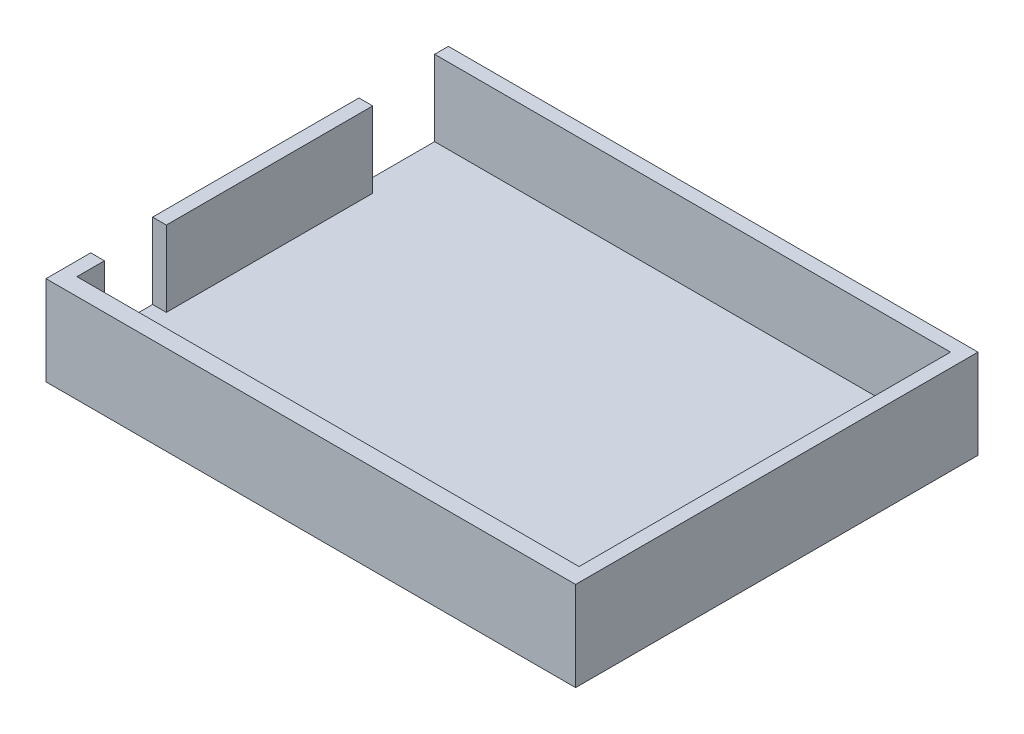
ISO-10303-21;
HEADER;
FILE_DESCRIPTION(('STEP AP214'),'2;1');
FILE_NAME('part.step','',(''),(''),'','','');
FILE_SCHEMA(('AUTOMOTIVE_DESIGN { 1 0 10303 214 1 1 1 1 }'));
ENDSEC;
DATA;
#1=APPLICATION_CONTEXT('core data for automotive mechanical design processes');
#2=APPLICATION_PROTOCOL_DEFINITION('international standard','automotive_design',2000,#1);
#3=PRODUCT_CONTEXT('',#1,'mechanical');
#4=PRODUCT('Part','Part','',(#3));
#5=PRODUCT_RELATED_PRODUCT_CATEGORY('part','',(#4));
#6=PRODUCT_DEFINITION_FORMATION('','',#4);
#7=PRODUCT_DEFINITION_CONTEXT('part definition',#1,'design');
#8=PRODUCT_DEFINITION('design','',#6,#7);
#9=PRODUCT_DEFINITION_SHAPE('','',#8);
#10=(LENGTH_UNIT() NAMED_UNIT(*) SI_UNIT(.MILLI.,.METRE.));
#11=(NAMED_UNIT(*) PLANE_ANGLE_UNIT() SI_UNIT($,.RADIAN.));
#12=(NAMED_UNIT(*) SI_UNIT($,.STERADIAN.) SOLID_ANGLE_UNIT());
#13=UNCERTAINTY_MEASURE_WITH_UNIT(LENGTH_MEASURE(1.E-05),#10,'distance_accuracy_value','');
#14=(GEOMETRIC_REPRESENTATION_CONTEXT(3) GLOBAL_UNCERTAINTY_ASSIGNED_CONTEXT((#13)) GLOBAL_UNIT_ASSIGNED_CONTEXT((#10,
#11,#12)) REPRESENTATION_CONTEXT('',''));
#15=CARTESIAN_POINT('',(0.,0.,0.));
#16=DIRECTION('',(0.,0.,1.));
#17=DIRECTION('',(1.,0.,0.));
#18=AXIS2_PLACEMENT_3D('',#15,#16,#17);
#19=CARTESIAN_POINT('',(0.,13.,0.));
#20=DIRECTION('',(0.,-1.,0.));
#21=DIRECTION('',(0.,0.,-1.));
#22=AXIS2_PLACEMENT_3D('',#19,#20,#21);
#23=PLANE('',#22);
#24=DIRECTION('',(0.,0.,1.));
#25=VECTOR('',#24,1.);
#26=CARTESIAN_POINT('',(-36.5,13.,26.75));
#27=LINE('',#26,#25);
#28=CARTESIAN_POINT('',(-36.5,13.,-16.25));
#29=VERTEX_POINT('',#28);
#30=CARTESIAN_POINT('',(-36.5,13.,13.75));
#31=VERTEX_POINT('',#30);
#32=EDGE_CURVE('E151',#29,#31,#27,.T.);
#33=ORIENTED_EDGE('',*,*,#32,.F.);
#34=DIRECTION('',(-1.,0.,0.));
#35=VECTOR('',#34,1.);
#36=CARTESIAN_POINT('',(38.501,13.,-16.25));
#37=LINE('',#36,#35);
#38=CARTESIAN_POINT('',(-38.5,13.,-16.25));
#39=VERTEX_POINT('',#38);
#40=EDGE_CURVE('E136',#29,#39,#37,.T.);
#41=ORIENTED_EDGE('',*,*,#40,.T.);
#42=DIRECTION('',(0.,0.,1.));
#43=VECTOR('',#42,1.);
#44=CARTESIAN_POINT('',(-38.5,13.,29.25));
#45=LINE('',#44,#43);
#46=CARTESIAN_POINT('',(-38.5,13.,13.75));
#47=VERTEX_POINT('',#46);
#48=EDGE_CURVE('E197',#39,#47,#45,.T.);
#49=ORIENTED_EDGE('',*,*,#48,.T.);
#50=DIRECTION('',(-1.,0.,0.));
#51=VECTOR('',#50,1.);
#52=CARTESIAN_POINT('',(38.501,13.,13.75));
#53=LINE('',#52,#51);
#54=EDGE_CURVE('E158',#31,#47,#53,.T.);
#55=ORIENTED_EDGE('',*,*,#54,.F.);
#56=EDGE_LOOP('',(#33,#41,#49,#55));
#57=FACE_BOUND('',#56,.T.);
#58=ADVANCED_FACE('F37',(#57),#23,.F.);
#59=CARTESIAN_POINT('',(-36.5,13.,26.75));
#60=DIRECTION('',(1.,0.,0.));
#61=DIRECTION('',(0.,0.,-1.));
#62=AXIS2_PLACEMENT_3D('',#59,#60,#61);
#63=PLANE('',#62);
#64=DIRECTION('',(0.,1.,0.));
#65=VECTOR('',#64,1.);
#66=CARTESIAN_POINT('',(-36.5,13.,-16.25));
#67=LINE('',#66,#65);
#68=CARTESIAN_POINT('',(-36.5,2.,-16.25));
#69=VERTEX_POINT('',#68);
#70=EDGE_CURVE('E139',#69,#29,#67,.T.);
#71=ORIENTED_EDGE('',*,*,#70,.T.);
#72=ORIENTED_EDGE('',*,*,#32,.T.);
#73=DIRECTION('',(0.,-1.,0.));
#74=VECTOR('',#73,1.);
#75=CARTESIAN_POINT('',(-36.5,13.,13.75));
#76=LINE('',#75,#74);
#77=CARTESIAN_POINT('',(-36.5,2.,13.75));
#78=VERTEX_POINT('',#77);
#79=EDGE_CURVE('E146',#31,#78,#76,.T.);
#80=ORIENTED_EDGE('',*,*,#79,.T.);
#81=DIRECTION('',(0.,0.,1.));
#82=VECTOR('',#81,1.);
#83=CARTESIAN_POINT('',(-36.5,2.,26.75));
#84=LINE('',#83,#82);
#85=EDGE_CURVE('E153',#69,#78,#84,.T.);
#86=ORIENTED_EDGE('',*,*,#85,.F.);
#87=EDGE_LOOP('',(#71,#72,#80,#86));
#88=FACE_BOUND('',#87,.T.);
#89=ADVANCED_FACE('F149',(#88),#63,.T.);
#90=CARTESIAN_POINT('',(-38.5,2.,29.25));
#91=DIRECTION('',(1.,0.,0.));
#92=DIRECTION('',(0.,0.,-1.));
#93=AXIS2_PLACEMENT_3D('',#90,#91,#92);
#94=PLANE('',#93);
#95=ORIENTED_EDGE('',*,*,#48,.F.);
#96=DIRECTION('',(0.,1.,0.));
#97=VECTOR('',#96,1.);
#98=CARTESIAN_POINT('',(-38.5,13.,-16.25));
#99=LINE('',#98,#97);
#100=CARTESIAN_POINT('',(-38.5,2.,-16.25));
#101=VERTEX_POINT('',#100);
#102=EDGE_CURVE('E142',#101,#39,#99,.T.);
#103=ORIENTED_EDGE('',*,*,#102,.F.);
#104=DIRECTION('',(0.,0.,1.));
#105=VECTOR('',#104,1.);
#106=CARTESIAN_POINT('',(-38.5,2.,-27.25));
#107=LINE('',#106,#105);
#108=CARTESIAN_POINT('',(-38.5,2.,-27.25));
#109=VERTEX_POINT('',#108);
#110=EDGE_CURVE('E285',#109,#101,#107,.T.);
#111=ORIENTED_EDGE('',*,*,#110,.F.);
#112=DIRECTION('',(0.,-1.,0.));
#113=VECTOR('',#112,1.);
#114=CARTESIAN_POINT('',(-38.5,13.,-27.25));
#115=LINE('',#114,#113);
#116=CARTESIAN_POINT('',(-38.5,13.,-27.25));
#117=VERTEX_POINT('',#116);
#118=EDGE_CURVE('E154',#117,#109,#115,.T.);
#119=ORIENTED_EDGE('',*,*,#118,.F.);
#120=CARTESIAN_POINT('',(-38.5,13.,-29.25));
#121=VERTEX_POINT('',#120);
#122=EDGE_CURVE('E193',#121,#117,#45,.T.);
#123=ORIENTED_EDGE('',*,*,#122,.F.);
#124=DIRECTION('',(0.,-1.,0.));
#125=VECTOR('',#124,1.);
#126=CARTESIAN_POINT('',(-38.5,2.,-29.25));
#127=LINE('',#126,#125);
#128=CARTESIAN_POINT('',(-38.5,0.,-29.25));
#129=VERTEX_POINT('',#128);
#130=EDGE_CURVE('E209',#121,#129,#127,.T.);
#131=ORIENTED_EDGE('',*,*,#130,.T.);
#132=DIRECTION('',(0.,0.,1.));
#133=VECTOR('',#132,1.);
#134=CARTESIAN_POINT('',(-38.5,0.,29.25));
#135=LINE('',#134,#133);
#136=CARTESIAN_POINT('',(-38.5,0.,29.25));
#137=VERTEX_POINT('',#136);
#138=EDGE_CURVE('E200',#129,#137,#135,.T.);
#139=ORIENTED_EDGE('',*,*,#138,.T.);
#140=DIRECTION('',(0.,-1.,0.));
#141=VECTOR('',#140,1.);
#142=CARTESIAN_POINT('',(-38.5,2.,29.25));
#143=LINE('',#142,#141);
#144=CARTESIAN_POINT('',(-38.5,13.,29.25));
#145=VERTEX_POINT('',#144);
#146=EDGE_CURVE('E11',#145,#137,#143,.T.);
#147=ORIENTED_EDGE('',*,*,#146,.F.);
#148=CARTESIAN_POINT('',(-38.5,13.,22.75));
#149=VERTEX_POINT('',#148);
#150=EDGE_CURVE('E192',#149,#145,#45,.T.);
#151=ORIENTED_EDGE('',*,*,#150,.F.);
#152=DIRECTION('',(0.,1.,0.));
#153=VECTOR('',#152,1.);
#154=CARTESIAN_POINT('',(-38.5,13.,22.75));
#155=LINE('',#154,#153);
#156=CARTESIAN_POINT('',(-38.5,2.,22.75));
#157=VERTEX_POINT('',#156);
#158=EDGE_CURVE('E243',#157,#149,#155,.T.);
#159=ORIENTED_EDGE('',*,*,#158,.F.);
#160=DIRECTION('',(0.,0.,1.));
#161=VECTOR('',#160,1.);
#162=CARTESIAN_POINT('',(-38.5,2.,13.75));
#163=LINE('',#162,#161);
#164=CARTESIAN_POINT('',(-38.5,2.,13.75));
#165=VERTEX_POINT('',#164);
#166=EDGE_CURVE('E253',#165,#157,#163,.T.);
#167=ORIENTED_EDGE('',*,*,#166,.F.);
#168=DIRECTION('',(0.,-1.,0.));
#169=VECTOR('',#168,1.);
#170=CARTESIAN_POINT('',(-38.5,13.,13.75));
#171=LINE('',#170,#169);
#172=EDGE_CURVE('E249',#47,#165,#171,.T.);
#173=ORIENTED_EDGE('',*,*,#172,.F.);
#174=EDGE_LOOP('',(#95,#103,#111,#119,#123,#131,#139,#147,#151,#159,#167,#173));
#175=FACE_BOUND('',#174,.T.);
#176=ADVANCED_FACE('F39',(#175),#94,.F.);
#177=CARTESIAN_POINT('',(-38.5,2.,29.25));
#178=DIRECTION('',(0.,0.,-1.));
#179=DIRECTION('',(-1.,0.,0.));
#180=AXIS2_PLACEMENT_3D('',#177,#178,#179);
#181=PLANE('',#180);
#182=DIRECTION('',(1.,0.,0.));
#183=VECTOR('',#182,1.);
#184=CARTESIAN_POINT('',(-38.5,0.,29.25));
#185=LINE('',#184,#183);
#186=CARTESIAN_POINT('',(38.5,0.,29.25));
#187=VERTEX_POINT('',#186);
#188=EDGE_CURVE('E203',#137,#187,#185,.T.);
#189=ORIENTED_EDGE('',*,*,#188,.T.);
#190=DIRECTION('',(0.,-1.,0.));
#191=VECTOR('',#190,1.);
#192=CARTESIAN_POINT('',(38.5,2.,29.25));
#193=LINE('',#192,#191);
#194=CARTESIAN_POINT('',(38.5,13.,29.25));
#195=VERTEX_POINT('',#194);
#196=EDGE_CURVE('E45',#195,#187,#193,.T.);
#197=ORIENTED_EDGE('',*,*,#196,.F.);
#198=DIRECTION('',(1.,0.,0.));
#199=VECTOR('',#198,1.);
#200=CARTESIAN_POINT('',(-38.5,13.,29.25));
#201=LINE('',#200,#199);
#202=EDGE_CURVE('E196',#145,#195,#201,.T.);
#203=ORIENTED_EDGE('',*,*,#202,.F.);
#204=ORIENTED_EDGE('',*,*,#146,.T.);
#205=EDGE_LOOP('',(#189,#197,#203,#204));
#206=FACE_BOUND('',#205,.T.);
#207=ADVANCED_FACE('F240',(#206),#181,.F.);
#208=CARTESIAN_POINT('',(38.5,2.,29.25));
#209=DIRECTION('',(-1.,0.,0.));
#210=DIRECTION('',(0.,0.,1.));
#211=AXIS2_PLACEMENT_3D('',#208,#209,#210);
#212=PLANE('',#211);
#213=DIRECTION('',(0.,0.,-1.));
#214=VECTOR('',#213,1.);
#215=CARTESIAN_POINT('',(38.5,0.,29.25));
#216=LINE('',#215,#214);
#217=CARTESIAN_POINT('',(38.5,0.,-29.25));
#218=VERTEX_POINT('',#217);
#219=EDGE_CURVE('E205',#187,#218,#216,.T.);
#220=ORIENTED_EDGE('',*,*,#219,.T.);
#221=DIRECTION('',(0.,-1.,0.));
#222=VECTOR('',#221,1.);
#223=CARTESIAN_POINT('',(38.5,2.,-29.25));
#224=LINE('',#223,#222);
#225=CARTESIAN_POINT('',(38.5,13.,-29.25));
#226=VERTEX_POINT('',#225);
#227=EDGE_CURVE('E212',#226,#218,#224,.T.);
#228=ORIENTED_EDGE('',*,*,#227,.F.);
#229=DIRECTION('',(0.,0.,-1.));
#230=VECTOR('',#229,1.);
#231=CARTESIAN_POINT('',(38.5,13.,29.25));
#232=LINE('',#231,#230);
#233=EDGE_CURVE('E186',#195,#226,#232,.T.);
#234=ORIENTED_EDGE('',*,*,#233,.F.);
#235=ORIENTED_EDGE('',*,*,#196,.T.);
#236=EDGE_LOOP('',(#220,#228,#234,#235));
#237=FACE_BOUND('',#236,.T.);
#238=ADVANCED_FACE('F218',(#237),#212,.F.);
#239=CARTESIAN_POINT('',(-38.5,2.,-29.25));
#240=DIRECTION('',(0.,0.,1.));
#241=DIRECTION('',(1.,0.,0.));
#242=AXIS2_PLACEMENT_3D('',#239,#240,#241);
#243=PLANE('',#242);
#244=DIRECTION('',(-1.,0.,0.));
#245=VECTOR('',#244,1.);
#246=CARTESIAN_POINT('',(-38.5,0.,-29.25));
#247=LINE('',#246,#245);
#248=EDGE_CURVE('E207',#218,#129,#247,.T.);
#249=ORIENTED_EDGE('',*,*,#248,.T.);
#250=ORIENTED_EDGE('',*,*,#130,.F.);
#251=DIRECTION('',(-1.,0.,0.));
#252=VECTOR('',#251,1.);
#253=CARTESIAN_POINT('',(-38.5,13.,-29.25));
#254=LINE('',#253,#252);
#255=EDGE_CURVE('E189',#226,#121,#254,.T.);
#256=ORIENTED_EDGE('',*,*,#255,.F.);
#257=ORIENTED_EDGE('',*,*,#227,.T.);
#258=EDGE_LOOP('',(#249,#250,#256,#257));
#259=FACE_BOUND('',#258,.T.);
#260=ADVANCED_FACE('F226',(#259),#243,.F.);
#261=CARTESIAN_POINT('',(0.,0.,0.));
#262=DIRECTION('',(0.,-1.,0.));
#263=DIRECTION('',(0.,0.,-1.));
#264=AXIS2_PLACEMENT_3D('',#261,#262,#263);
#265=PLANE('',#264);
#266=ORIENTED_EDGE('',*,*,#138,.F.);
#267=ORIENTED_EDGE('',*,*,#248,.F.);
#268=ORIENTED_EDGE('',*,*,#219,.F.);
#269=ORIENTED_EDGE('',*,*,#188,.F.);
#270=EDGE_LOOP('',(#266,#267,#268,#269));
#271=FACE_BOUND('',#270,.T.);
#272=ADVANCED_FACE('F224',(#271),#265,.T.);
#273=ORIENTED_EDGE('',*,*,#122,.T.);
#274=DIRECTION('',(-1.,0.,0.));
#275=VECTOR('',#274,1.);
#276=CARTESIAN_POINT('',(-36.5,13.,-27.25));
#277=LINE('',#276,#275);
#278=CARTESIAN_POINT('',(36.5,13.,-27.25));
#279=VERTEX_POINT('',#278);
#280=EDGE_CURVE('E164',#279,#117,#277,.T.);
#281=ORIENTED_EDGE('',*,*,#280,.F.);
#282=DIRECTION('',(0.,0.,-1.));
#283=VECTOR('',#282,1.);
#284=CARTESIAN_POINT('',(36.5,13.,26.75));
#285=LINE('',#284,#283);
#286=CARTESIAN_POINT('',(36.5,13.,26.75));
#287=VERTEX_POINT('',#286);
#288=EDGE_CURVE('E178',#287,#279,#285,.T.);
#289=ORIENTED_EDGE('',*,*,#288,.F.);
#290=DIRECTION('',(1.,0.,0.));
#291=VECTOR('',#290,1.);
#292=CARTESIAN_POINT('',(-36.5,13.,26.75));
#293=LINE('',#292,#291);
#294=CARTESIAN_POINT('',(-36.5,13.,26.75));
#295=VERTEX_POINT('',#294);
#296=EDGE_CURVE('E159',#295,#287,#293,.T.);
#297=ORIENTED_EDGE('',*,*,#296,.F.);
#298=CARTESIAN_POINT('',(-36.5,13.,22.75));
#299=VERTEX_POINT('',#298);
#300=EDGE_CURVE('E160',#299,#295,#27,.T.);
#301=ORIENTED_EDGE('',*,*,#300,.F.);
#302=DIRECTION('',(-1.,0.,0.));
#303=VECTOR('',#302,1.);
#304=CARTESIAN_POINT('',(38.501,13.,22.75));
#305=LINE('',#304,#303);
#306=EDGE_CURVE('E251',#299,#149,#305,.T.);
#307=ORIENTED_EDGE('',*,*,#306,.T.);
#308=ORIENTED_EDGE('',*,*,#150,.T.);
#309=ORIENTED_EDGE('',*,*,#202,.T.);
#310=ORIENTED_EDGE('',*,*,#233,.T.);
#311=ORIENTED_EDGE('',*,*,#255,.T.);
#312=EDGE_LOOP('',(#273,#281,#289,#297,#301,#307,#308,#309,#310,#311));
#313=FACE_BOUND('',#312,.T.);
#314=ADVANCED_FACE('F236',(#313),#23,.F.);
#315=CARTESIAN_POINT('',(36.5,13.,26.75));
#316=DIRECTION('',(-1.,0.,0.));
#317=DIRECTION('',(0.,0.,1.));
#318=AXIS2_PLACEMENT_3D('',#315,#316,#317);
#319=PLANE('',#318);
#320=DIRECTION('',(0.,0.,-1.));
#321=VECTOR('',#320,1.);
#322=CARTESIAN_POINT('',(36.5,2.,26.75));
#323=LINE('',#322,#321);
#324=CARTESIAN_POINT('',(36.5,2.,26.75));
#325=VERTEX_POINT('',#324);
#326=CARTESIAN_POINT('',(36.5,2.,-27.25));
#327=VERTEX_POINT('',#326);
#328=EDGE_CURVE('E168',#325,#327,#323,.T.);
#329=ORIENTED_EDGE('',*,*,#328,.F.);
#330=DIRECTION('',(0.,-1.,0.));
#331=VECTOR('',#330,1.);
#332=CARTESIAN_POINT('',(36.5,13.,26.75));
#333=LINE('',#332,#331);
#334=EDGE_CURVE('E162',#287,#325,#333,.T.);
#335=ORIENTED_EDGE('',*,*,#334,.F.);
#336=ORIENTED_EDGE('',*,*,#288,.T.);
#337=DIRECTION('',(0.,-1.,0.));
#338=VECTOR('',#337,1.);
#339=CARTESIAN_POINT('',(36.5,13.,-27.25));
#340=LINE('',#339,#338);
#341=EDGE_CURVE('E183',#279,#327,#340,.T.);
#342=ORIENTED_EDGE('',*,*,#341,.T.);
#343=EDGE_LOOP('',(#329,#335,#336,#342));
#344=FACE_BOUND('',#343,.T.);
#345=ADVANCED_FACE('F268',(#344),#319,.T.);
#346=CARTESIAN_POINT('',(-36.5,13.,-27.25));
#347=DIRECTION('',(0.,0.,1.));
#348=DIRECTION('',(1.,0.,0.));
#349=AXIS2_PLACEMENT_3D('',#346,#347,#348);
#350=PLANE('',#349);
#351=DIRECTION('',(-1.,0.,0.));
#352=VECTOR('',#351,1.);
#353=CARTESIAN_POINT('',(-36.5,2.,-27.25));
#354=LINE('',#353,#352);
#355=EDGE_CURVE('E171',#327,#109,#354,.T.);
#356=ORIENTED_EDGE('',*,*,#355,.F.);
#357=ORIENTED_EDGE('',*,*,#341,.F.);
#358=ORIENTED_EDGE('',*,*,#280,.T.);
#359=ORIENTED_EDGE('',*,*,#118,.T.);
#360=EDGE_LOOP('',(#356,#357,#358,#359));
#361=FACE_BOUND('',#360,.T.);
#362=ADVANCED_FACE('F266',(#361),#350,.T.);
#363=DIRECTION('',(0.,1.,0.));
#364=VECTOR('',#363,1.);
#365=CARTESIAN_POINT('',(-36.5,13.,22.75));
#366=LINE('',#365,#364);
#367=CARTESIAN_POINT('',(-36.5,2.,22.75));
#368=VERTEX_POINT('',#367);
#369=EDGE_CURVE('E256',#368,#299,#366,.T.);
#370=ORIENTED_EDGE('',*,*,#369,.T.);
#371=ORIENTED_EDGE('',*,*,#300,.T.);
#372=DIRECTION('',(0.,-1.,0.));
#373=VECTOR('',#372,1.);
#374=CARTESIAN_POINT('',(-36.5,13.,26.75));
#375=LINE('',#374,#373);
#376=CARTESIAN_POINT('',(-36.5,2.,26.75));
#377=VERTEX_POINT('',#376);
#378=EDGE_CURVE('E180',#295,#377,#375,.T.);
#379=ORIENTED_EDGE('',*,*,#378,.T.);
#380=EDGE_CURVE('E173',#368,#377,#84,.T.);
#381=ORIENTED_EDGE('',*,*,#380,.F.);
#382=EDGE_LOOP('',(#370,#371,#379,#381));
#383=FACE_BOUND('',#382,.T.);
#384=ADVANCED_FACE('F279',(#383),#63,.T.);
#385=CARTESIAN_POINT('',(-36.5,13.,26.75));
#386=DIRECTION('',(0.,0.,-1.));
#387=DIRECTION('',(-1.,0.,0.));
#388=AXIS2_PLACEMENT_3D('',#385,#386,#387);
#389=PLANE('',#388);
#390=DIRECTION('',(1.,0.,0.));
#391=VECTOR('',#390,1.);
#392=CARTESIAN_POINT('',(-36.5,2.,26.75));
#393=LINE('',#392,#391);
#394=EDGE_CURVE('E175',#377,#325,#393,.T.);
#395=ORIENTED_EDGE('',*,*,#394,.F.);
#396=ORIENTED_EDGE('',*,*,#378,.F.);
#397=ORIENTED_EDGE('',*,*,#296,.T.);
#398=ORIENTED_EDGE('',*,*,#334,.T.);
#399=EDGE_LOOP('',(#395,#396,#397,#398));
#400=FACE_BOUND('',#399,.T.);
#401=ADVANCED_FACE('F274',(#400),#389,.T.);
#402=CARTESIAN_POINT('',(0.,2.,0.));
#403=DIRECTION('',(0.,-1.,0.));
#404=DIRECTION('',(0.,0.,-1.));
#405=AXIS2_PLACEMENT_3D('',#402,#403,#404);
#406=PLANE('',#405);
#407=ORIENTED_EDGE('',*,*,#394,.T.);
#408=ORIENTED_EDGE('',*,*,#328,.T.);
#409=ORIENTED_EDGE('',*,*,#355,.T.);
#410=ORIENTED_EDGE('',*,*,#110,.T.);
#411=DIRECTION('',(-1.,0.,0.));
#412=VECTOR('',#411,1.);
#413=CARTESIAN_POINT('',(38.501,2.,-16.25));
#414=LINE('',#413,#412);
#415=EDGE_CURVE('E52',#69,#101,#414,.T.);
#416=ORIENTED_EDGE('',*,*,#415,.F.);
#417=ORIENTED_EDGE('',*,*,#85,.T.);
#418=DIRECTION('',(-1.,0.,0.));
#419=VECTOR('',#418,1.);
#420=CARTESIAN_POINT('',(38.501,2.,13.75));
#421=LINE('',#420,#419);
#422=EDGE_CURVE('E250',#78,#165,#421,.T.);
#423=ORIENTED_EDGE('',*,*,#422,.T.);
#424=ORIENTED_EDGE('',*,*,#166,.T.);
#425=DIRECTION('',(-1.,0.,0.));
#426=VECTOR('',#425,1.);
#427=CARTESIAN_POINT('',(38.501,2.,22.75));
#428=LINE('',#427,#426);
#429=EDGE_CURVE('E59',#368,#157,#428,.T.);
#430=ORIENTED_EDGE('',*,*,#429,.F.);
#431=ORIENTED_EDGE('',*,*,#380,.T.);
#432=EDGE_LOOP('',(#407,#408,#409,#410,#416,#417,#423,#424,#430,#431));
#433=FACE_BOUND('',#432,.T.);
#434=ADVANCED_FACE('F269',(#433),#406,.F.);
#435=CARTESIAN_POINT('',(38.501,13.,13.75));
#436=DIRECTION('',(0.,0.,-1.));
#437=DIRECTION('',(0.,1.,0.));
#438=AXIS2_PLACEMENT_3D('',#435,#436,#437);
#439=PLANE('',#438);
#440=ORIENTED_EDGE('',*,*,#54,.T.);
#441=ORIENTED_EDGE('',*,*,#172,.T.);
#442=ORIENTED_EDGE('',*,*,#422,.F.);
#443=ORIENTED_EDGE('',*,*,#79,.F.);
#444=EDGE_LOOP('',(#440,#441,#442,#443));
#445=FACE_BOUND('',#444,.T.);
#446=ADVANCED_FACE('F247',(#445),#439,.F.);
#447=CARTESIAN_POINT('',(38.501,13.,22.75));
#448=DIRECTION('',(0.,0.,1.));
#449=DIRECTION('',(1.,0.,0.));
#450=AXIS2_PLACEMENT_3D('',#447,#448,#449);
#451=PLANE('',#450);
#452=ORIENTED_EDGE('',*,*,#429,.T.);
#453=ORIENTED_EDGE('',*,*,#158,.T.);
#454=ORIENTED_EDGE('',*,*,#306,.F.);
#455=ORIENTED_EDGE('',*,*,#369,.F.);
#456=EDGE_LOOP('',(#452,#453,#454,#455));
#457=FACE_BOUND('',#456,.T.);
#458=ADVANCED_FACE('F287',(#457),#451,.F.);
#459=CARTESIAN_POINT('',(38.501,13.,-16.25));
#460=DIRECTION('',(0.,0.,1.));
#461=DIRECTION('',(1.,0.,0.));
#462=AXIS2_PLACEMENT_3D('',#459,#460,#461);
#463=PLANE('',#462);
#464=ORIENTED_EDGE('',*,*,#415,.T.);
#465=ORIENTED_EDGE('',*,*,#102,.T.);
#466=ORIENTED_EDGE('',*,*,#40,.F.);
#467=ORIENTED_EDGE('',*,*,#70,.F.);
#468=EDGE_LOOP('',(#464,#465,#466,#467));
#469=FACE_BOUND('',#468,.T.);
#470=ADVANCED_FACE('F138',(#469),#463,.F.);
#471=CLOSED_SHELL('',(#58,#89,#176,#207,#238,#260,#272,#314,#345,#362,#384,#401,#434,#446,#458,#470));
#472=MANIFOLD_SOLID_BREP('B2',#471);
#473=ADVANCED_BREP_SHAPE_REPRESENTATION('',(#18,#472),#14);
#474=SHAPE_DEFINITION_REPRESENTATION(#9,#473);
ENDSEC;
END-ISO-10303-21;
